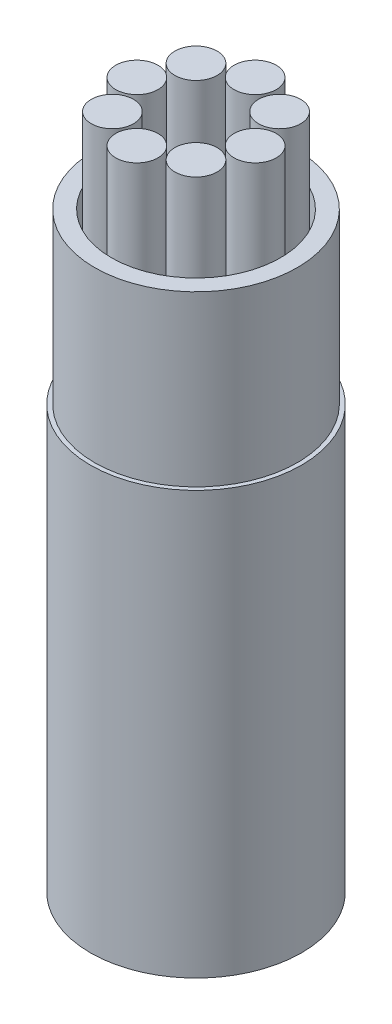
ISO-10303-21;
HEADER;
FILE_DESCRIPTION(('STEP AP214'),'2;1');
FILE_NAME('part.step','',(''),(''),'','','');
FILE_SCHEMA(('AUTOMOTIVE_DESIGN { 1 0 10303 214 1 1 1 1 }'));
ENDSEC;
DATA;
#1=APPLICATION_CONTEXT('core data for automotive mechanical design processes');
#2=APPLICATION_PROTOCOL_DEFINITION('international standard','automotive_design',2000,#1);
#3=PRODUCT_CONTEXT('',#1,'mechanical');
#4=PRODUCT('Part','Part','',(#3));
#5=PRODUCT_RELATED_PRODUCT_CATEGORY('part','',(#4));
#6=PRODUCT_DEFINITION_FORMATION('','',#4);
#7=PRODUCT_DEFINITION_CONTEXT('part definition',#1,'design');
#8=PRODUCT_DEFINITION('design','',#6,#7);
#9=PRODUCT_DEFINITION_SHAPE('','',#8);
#10=(LENGTH_UNIT() NAMED_UNIT(*) SI_UNIT(.MILLI.,.METRE.));
#11=(NAMED_UNIT(*) PLANE_ANGLE_UNIT() SI_UNIT($,.RADIAN.));
#12=(NAMED_UNIT(*) SI_UNIT($,.STERADIAN.) SOLID_ANGLE_UNIT());
#13=UNCERTAINTY_MEASURE_WITH_UNIT(LENGTH_MEASURE(1.E-05),#10,'distance_accuracy_value','');
#14=(GEOMETRIC_REPRESENTATION_CONTEXT(3) GLOBAL_UNCERTAINTY_ASSIGNED_CONTEXT((#13)) GLOBAL_UNIT_ASSIGNED_CONTEXT((#10,
#11,#12)) REPRESENTATION_CONTEXT('',''));
#15=CARTESIAN_POINT('',(0.,0.,0.));
#16=DIRECTION('',(0.,0.,1.));
#17=DIRECTION('',(1.,0.,0.));
#18=AXIS2_PLACEMENT_3D('',#15,#16,#17);
#19=CARTESIAN_POINT('',(0.,10.,0.));
#20=DIRECTION('',(0.,-1.,0.));
#21=DIRECTION('',(0.,0.,-1.));
#22=AXIS2_PLACEMENT_3D('',#19,#20,#21);
#23=CYLINDRICAL_SURFACE('',#22,2.5);
#24=CARTESIAN_POINT('',(0.,10.,0.));
#25=DIRECTION('',(0.,1.,0.));
#26=DIRECTION('',(0.,0.,1.));
#27=AXIS2_PLACEMENT_3D('',#24,#25,#26);
#28=CIRCLE('',#27,2.5);
#29=CARTESIAN_POINT('',(0.,10.,2.5));
#30=VERTEX_POINT('',#29);
#31=EDGE_CURVE('E39',#30,#30,#28,.T.);
#32=ORIENTED_EDGE('',*,*,#31,.F.);
#33=EDGE_LOOP('',(#32));
#34=FACE_BOUND('',#33,.T.);
#35=CARTESIAN_POINT('',(0.,0.,0.));
#36=DIRECTION('',(0.,1.,0.));
#37=DIRECTION('',(0.,0.,1.));
#38=AXIS2_PLACEMENT_3D('',#35,#36,#37);
#39=CIRCLE('',#38,2.5);
#40=CARTESIAN_POINT('',(0.,0.,2.5));
#41=VERTEX_POINT('',#40);
#42=EDGE_CURVE('E43',#41,#41,#39,.T.);
#43=ORIENTED_EDGE('',*,*,#42,.T.);
#44=EDGE_LOOP('',(#43));
#45=FACE_BOUND('',#44,.T.);
#46=ADVANCED_FACE('F33',(#34,#45),#23,.T.);
#47=CARTESIAN_POINT('',(0.,10.,0.));
#48=DIRECTION('',(0.,1.,0.));
#49=DIRECTION('',(0.,0.,1.));
#50=AXIS2_PLACEMENT_3D('',#47,#48,#49);
#51=PLANE('',#50);
#52=CARTESIAN_POINT('',(0.,10.,0.));
#53=DIRECTION('',(0.,1.,0.));
#54=DIRECTION('',(0.,0.,1.));
#55=AXIS2_PLACEMENT_3D('',#52,#53,#54);
#56=CIRCLE('',#55,2.4);
#57=CARTESIAN_POINT('',(0.,10.,2.4));
#58=VERTEX_POINT('',#57);
#59=EDGE_CURVE('E98',#58,#58,#56,.T.);
#60=ORIENTED_EDGE('',*,*,#59,.F.);
#61=EDGE_LOOP('',(#60));
#62=FACE_BOUND('',#61,.T.);
#63=ORIENTED_EDGE('',*,*,#31,.T.);
#64=EDGE_LOOP('',(#63));
#65=FACE_BOUND('',#64,.T.);
#66=ADVANCED_FACE('F121',(#62,#65),#51,.T.);
#67=CARTESIAN_POINT('',(0.,0.,0.));
#68=DIRECTION('',(0.,1.,0.));
#69=DIRECTION('',(0.,0.,1.));
#70=AXIS2_PLACEMENT_3D('',#67,#68,#69);
#71=PLANE('',#70);
#72=ORIENTED_EDGE('',*,*,#42,.F.);
#73=EDGE_LOOP('',(#72));
#74=FACE_BOUND('',#73,.T.);
#75=ADVANCED_FACE('F112',(#74),#71,.F.);
#76=CARTESIAN_POINT('',(0.,14.,0.));
#77=DIRECTION('',(0.,1.,0.));
#78=DIRECTION('',(0.,0.,1.));
#79=AXIS2_PLACEMENT_3D('',#76,#77,#78);
#80=PLANE('',#79);
#81=CARTESIAN_POINT('',(0.,14.,0.));
#82=DIRECTION('',(0.,1.,0.));
#83=DIRECTION('',(0.,0.,1.));
#84=AXIS2_PLACEMENT_3D('',#81,#82,#83);
#85=CIRCLE('',#84,2.4);
#86=CARTESIAN_POINT('',(0.,14.,2.4));
#87=VERTEX_POINT('',#86);
#88=EDGE_CURVE('E97',#87,#87,#85,.T.);
#89=ORIENTED_EDGE('',*,*,#88,.T.);
#90=EDGE_LOOP('',(#89));
#91=FACE_BOUND('',#90,.T.);
#92=CARTESIAN_POINT('',(0.,14.,0.));
#93=DIRECTION('',(0.,1.,0.));
#94=DIRECTION('',(0.,0.,1.));
#95=AXIS2_PLACEMENT_3D('',#92,#93,#94);
#96=CIRCLE('',#95,2.);
#97=CARTESIAN_POINT('',(0.,14.,2.));
#98=VERTEX_POINT('',#97);
#99=EDGE_CURVE('E101',#98,#98,#96,.T.);
#100=ORIENTED_EDGE('',*,*,#99,.F.);
#101=EDGE_LOOP('',(#100));
#102=FACE_BOUND('',#101,.T.);
#103=ADVANCED_FACE('F109',(#91,#102),#80,.T.);
#104=CARTESIAN_POINT('',(0.,14.,0.));
#105=DIRECTION('',(0.,-1.,0.));
#106=DIRECTION('',(0.,0.,-1.));
#107=AXIS2_PLACEMENT_3D('',#104,#105,#106);
#108=CYLINDRICAL_SURFACE('',#107,2.4);
#109=ORIENTED_EDGE('',*,*,#88,.F.);
#110=EDGE_LOOP('',(#109));
#111=FACE_BOUND('',#110,.T.);
#112=ORIENTED_EDGE('',*,*,#59,.T.);
#113=EDGE_LOOP('',(#112));
#114=FACE_BOUND('',#113,.T.);
#115=ADVANCED_FACE('F111',(#111,#114),#108,.T.);
#116=CARTESIAN_POINT('',(0.,14.,0.));
#117=DIRECTION('',(0.,-1.,0.));
#118=DIRECTION('',(0.,0.,-1.));
#119=AXIS2_PLACEMENT_3D('',#116,#117,#118);
#120=CYLINDRICAL_SURFACE('',#119,2.);
#121=ORIENTED_EDGE('',*,*,#99,.T.);
#122=EDGE_LOOP('',(#121));
#123=FACE_BOUND('',#122,.T.);
#124=CARTESIAN_POINT('',(0.,10.,0.));
#125=DIRECTION('',(0.,1.,0.));
#126=DIRECTION('',(0.,0.,1.));
#127=AXIS2_PLACEMENT_3D('',#124,#125,#126);
#128=CIRCLE('',#127,2.);
#129=CARTESIAN_POINT('',(0.,10.,2.));
#130=VERTEX_POINT('',#129);
#131=EDGE_CURVE('E10',#130,#130,#128,.F.);
#132=ORIENTED_EDGE('',*,*,#131,.T.);
#133=EDGE_LOOP('',(#132));
#134=FACE_BOUND('',#133,.T.);
#135=ADVANCED_FACE('F107',(#123,#134),#120,.F.);
#136=CARTESIAN_POINT('',(0.,16.,-1.4));
#137=DIRECTION('',(0.,1.,0.));
#138=DIRECTION('',(0.,0.,1.));
#139=AXIS2_PLACEMENT_3D('',#136,#137,#138);
#140=PLANE('',#139);
#141=CARTESIAN_POINT('',(-0.989949493661167,16.,-0.989949493661167));
#142=DIRECTION('',(0.,1.,0.));
#143=DIRECTION('',(0.,0.,1.));
#144=AXIS2_PLACEMENT_3D('',#141,#142,#143);
#145=CIRCLE('',#144,0.5);
#146=CARTESIAN_POINT('',(-0.989949493661167,16.,-0.489949493661166));
#147=VERTEX_POINT('',#146);
#148=EDGE_CURVE('E91',#147,#147,#145,.T.);
#149=ORIENTED_EDGE('',*,*,#148,.T.);
#150=EDGE_LOOP('',(#149));
#151=FACE_BOUND('',#150,.T.);
#152=ADVANCED_FACE('F171',(#151),#140,.T.);
#153=CARTESIAN_POINT('',(0.,16.,-1.4));
#154=DIRECTION('',(0.,1.,0.));
#155=DIRECTION('',(0.,0.,1.));
#156=AXIS2_PLACEMENT_3D('',#153,#154,#155);
#157=PLANE('',#156);
#158=CARTESIAN_POINT('',(-1.4,16.,0.));
#159=DIRECTION('',(0.,1.,0.));
#160=DIRECTION('',(0.,0.,1.));
#161=AXIS2_PLACEMENT_3D('',#158,#159,#160);
#162=CIRCLE('',#161,0.5);
#163=CARTESIAN_POINT('',(-1.4,16.,0.5));
#164=VERTEX_POINT('',#163);
#165=EDGE_CURVE('E85',#164,#164,#162,.T.);
#166=ORIENTED_EDGE('',*,*,#165,.T.);
#167=EDGE_LOOP('',(#166));
#168=FACE_BOUND('',#167,.T.);
#169=ADVANCED_FACE('F173',(#168),#157,.T.);
#170=CARTESIAN_POINT('',(0.,16.,-1.4));
#171=DIRECTION('',(0.,1.,0.));
#172=DIRECTION('',(0.,0.,1.));
#173=AXIS2_PLACEMENT_3D('',#170,#171,#172);
#174=PLANE('',#173);
#175=CARTESIAN_POINT('',(-0.989949493661166,16.,0.989949493661167));
#176=DIRECTION('',(0.,1.,0.));
#177=DIRECTION('',(0.,0.,1.));
#178=AXIS2_PLACEMENT_3D('',#175,#176,#177);
#179=CIRCLE('',#178,0.5);
#180=CARTESIAN_POINT('',(-0.989949493661166,16.,1.48994949366117));
#181=VERTEX_POINT('',#180);
#182=EDGE_CURVE('E79',#181,#181,#179,.T.);
#183=ORIENTED_EDGE('',*,*,#182,.T.);
#184=EDGE_LOOP('',(#183));
#185=FACE_BOUND('',#184,.T.);
#186=ADVANCED_FACE('F179',(#185),#174,.T.);
#187=CARTESIAN_POINT('',(0.,16.,-1.4));
#188=DIRECTION('',(0.,1.,0.));
#189=DIRECTION('',(0.,0.,1.));
#190=AXIS2_PLACEMENT_3D('',#187,#188,#189);
#191=PLANE('',#190);
#192=CARTESIAN_POINT('',(0.,16.,1.4));
#193=DIRECTION('',(0.,1.,0.));
#194=DIRECTION('',(0.,0.,1.));
#195=AXIS2_PLACEMENT_3D('',#192,#193,#194);
#196=CIRCLE('',#195,0.5);
#197=CARTESIAN_POINT('',(0.,16.,1.9));
#198=VERTEX_POINT('',#197);
#199=EDGE_CURVE('E73',#198,#198,#196,.T.);
#200=ORIENTED_EDGE('',*,*,#199,.T.);
#201=EDGE_LOOP('',(#200));
#202=FACE_BOUND('',#201,.T.);
#203=ADVANCED_FACE('F193',(#202),#191,.T.);
#204=CARTESIAN_POINT('',(0.,16.,-1.4));
#205=DIRECTION('',(0.,1.,0.));
#206=DIRECTION('',(0.,0.,1.));
#207=AXIS2_PLACEMENT_3D('',#204,#205,#206);
#208=PLANE('',#207);
#209=CARTESIAN_POINT('',(0.989949493661167,16.,0.989949493661166));
#210=DIRECTION('',(0.,1.,0.));
#211=DIRECTION('',(0.,0.,1.));
#212=AXIS2_PLACEMENT_3D('',#209,#210,#211);
#213=CIRCLE('',#212,0.5);
#214=CARTESIAN_POINT('',(0.989949493661167,16.,1.48994949366117));
#215=VERTEX_POINT('',#214);
#216=EDGE_CURVE('E67',#215,#215,#213,.T.);
#217=ORIENTED_EDGE('',*,*,#216,.T.);
#218=EDGE_LOOP('',(#217));
#219=FACE_BOUND('',#218,.T.);
#220=ADVANCED_FACE('F201',(#219),#208,.T.);
#221=CARTESIAN_POINT('',(0.,16.,-1.4));
#222=DIRECTION('',(0.,1.,0.));
#223=DIRECTION('',(0.,0.,1.));
#224=AXIS2_PLACEMENT_3D('',#221,#222,#223);
#225=PLANE('',#224);
#226=CARTESIAN_POINT('',(1.4,16.,0.));
#227=DIRECTION('',(0.,1.,0.));
#228=DIRECTION('',(0.,0.,1.));
#229=AXIS2_PLACEMENT_3D('',#226,#227,#228);
#230=CIRCLE('',#229,0.5);
#231=CARTESIAN_POINT('',(1.4,16.,0.5));
#232=VERTEX_POINT('',#231);
#233=EDGE_CURVE('E61',#232,#232,#230,.T.);
#234=ORIENTED_EDGE('',*,*,#233,.T.);
#235=EDGE_LOOP('',(#234));
#236=FACE_BOUND('',#235,.T.);
#237=ADVANCED_FACE('F209',(#236),#225,.T.);
#238=CARTESIAN_POINT('',(0.,16.,-1.4));
#239=DIRECTION('',(0.,1.,0.));
#240=DIRECTION('',(0.,0.,1.));
#241=AXIS2_PLACEMENT_3D('',#238,#239,#240);
#242=PLANE('',#241);
#243=CARTESIAN_POINT('',(0.989949493661166,16.,-0.989949493661167));
#244=DIRECTION('',(0.,1.,0.));
#245=DIRECTION('',(0.,0.,1.));
#246=AXIS2_PLACEMENT_3D('',#243,#244,#245);
#247=CIRCLE('',#246,0.5);
#248=CARTESIAN_POINT('',(0.989949493661166,16.,-0.489949493661167));
#249=VERTEX_POINT('',#248);
#250=EDGE_CURVE('E53',#249,#249,#247,.T.);
#251=ORIENTED_EDGE('',*,*,#250,.T.);
#252=EDGE_LOOP('',(#251));
#253=FACE_BOUND('',#252,.T.);
#254=ADVANCED_FACE('F216',(#253),#242,.T.);
#255=CARTESIAN_POINT('',(0.,16.,-1.4));
#256=DIRECTION('',(0.,1.,0.));
#257=DIRECTION('',(0.,0.,1.));
#258=AXIS2_PLACEMENT_3D('',#255,#256,#257);
#259=PLANE('',#258);
#260=CARTESIAN_POINT('',(0.,16.,-1.4));
#261=DIRECTION('',(0.,1.,0.));
#262=DIRECTION('',(0.,0.,1.));
#263=AXIS2_PLACEMENT_3D('',#260,#261,#262);
#264=CIRCLE('',#263,0.5);
#265=CARTESIAN_POINT('',(0.,16.,-0.9));
#266=VERTEX_POINT('',#265);
#267=EDGE_CURVE('E48',#266,#266,#264,.T.);
#268=ORIENTED_EDGE('',*,*,#267,.T.);
#269=EDGE_LOOP('',(#268));
#270=FACE_BOUND('',#269,.T.);
#271=ADVANCED_FACE('F167',(#270),#259,.T.);
#272=CARTESIAN_POINT('',(-0.989949493661167,17.4142135623731,-0.989949493661167));
#273=DIRECTION('',(0.,-1.,0.));
#274=DIRECTION('',(0.,0.,-1.));
#275=AXIS2_PLACEMENT_3D('',#272,#273,#274);
#276=CYLINDRICAL_SURFACE('',#275,0.5);
#277=CARTESIAN_POINT('',(-0.989949493661167,10.,-0.989949493661167));
#278=DIRECTION('',(0.,1.,0.));
#279=DIRECTION('',(0.,0.,1.));
#280=AXIS2_PLACEMENT_3D('',#277,#278,#279);
#281=CIRCLE('',#280,0.5);
#282=CARTESIAN_POINT('',(-0.989949493661167,10.,-0.489949493661166));
#283=VERTEX_POINT('',#282);
#284=EDGE_CURVE('E94',#283,#283,#281,.T.);
#285=ORIENTED_EDGE('',*,*,#284,.T.);
#286=EDGE_LOOP('',(#285));
#287=FACE_BOUND('',#286,.T.);
#288=ORIENTED_EDGE('',*,*,#148,.F.);
#289=EDGE_LOOP('',(#288));
#290=FACE_BOUND('',#289,.T.);
#291=ADVANCED_FACE('F163',(#287,#290),#276,.T.);
#292=CARTESIAN_POINT('',(-1.4,17.4142135623731,0.));
#293=DIRECTION('',(0.,-1.,0.));
#294=DIRECTION('',(0.,0.,-1.));
#295=AXIS2_PLACEMENT_3D('',#292,#293,#294);
#296=CYLINDRICAL_SURFACE('',#295,0.5);
#297=CARTESIAN_POINT('',(-1.4,10.,0.));
#298=DIRECTION('',(0.,1.,0.));
#299=DIRECTION('',(0.,0.,1.));
#300=AXIS2_PLACEMENT_3D('',#297,#298,#299);
#301=CIRCLE('',#300,0.5);
#302=CARTESIAN_POINT('',(-1.4,10.,0.5));
#303=VERTEX_POINT('',#302);
#304=EDGE_CURVE('E88',#303,#303,#301,.T.);
#305=ORIENTED_EDGE('',*,*,#304,.T.);
#306=EDGE_LOOP('',(#305));
#307=FACE_BOUND('',#306,.T.);
#308=ORIENTED_EDGE('',*,*,#165,.F.);
#309=EDGE_LOOP('',(#308));
#310=FACE_BOUND('',#309,.T.);
#311=ADVANCED_FACE('F166',(#307,#310),#296,.T.);
#312=CARTESIAN_POINT('',(-0.989949493661166,17.4142135623731,0.989949493661167));
#313=DIRECTION('',(0.,-1.,0.));
#314=DIRECTION('',(0.,0.,-1.));
#315=AXIS2_PLACEMENT_3D('',#312,#313,#314);
#316=CYLINDRICAL_SURFACE('',#315,0.5);
#317=CARTESIAN_POINT('',(-0.989949493661166,10.,0.989949493661167));
#318=DIRECTION('',(0.,1.,0.));
#319=DIRECTION('',(0.,0.,1.));
#320=AXIS2_PLACEMENT_3D('',#317,#318,#319);
#321=CIRCLE('',#320,0.5);
#322=CARTESIAN_POINT('',(-0.989949493661166,10.,1.48994949366117));
#323=VERTEX_POINT('',#322);
#324=EDGE_CURVE('E82',#323,#323,#321,.T.);
#325=ORIENTED_EDGE('',*,*,#324,.T.);
#326=EDGE_LOOP('',(#325));
#327=FACE_BOUND('',#326,.T.);
#328=ORIENTED_EDGE('',*,*,#182,.F.);
#329=EDGE_LOOP('',(#328));
#330=FACE_BOUND('',#329,.T.);
#331=ADVANCED_FACE('F184',(#327,#330),#316,.T.);
#332=CARTESIAN_POINT('',(0.,17.4142135623731,1.4));
#333=DIRECTION('',(0.,-1.,0.));
#334=DIRECTION('',(0.,0.,-1.));
#335=AXIS2_PLACEMENT_3D('',#332,#333,#334);
#336=CYLINDRICAL_SURFACE('',#335,0.5);
#337=CARTESIAN_POINT('',(0.,10.,1.4));
#338=DIRECTION('',(0.,1.,0.));
#339=DIRECTION('',(0.,0.,1.));
#340=AXIS2_PLACEMENT_3D('',#337,#338,#339);
#341=CIRCLE('',#340,0.5);
#342=CARTESIAN_POINT('',(0.,10.,1.9));
#343=VERTEX_POINT('',#342);
#344=EDGE_CURVE('E76',#343,#343,#341,.T.);
#345=ORIENTED_EDGE('',*,*,#344,.T.);
#346=EDGE_LOOP('',(#345));
#347=FACE_BOUND('',#346,.T.);
#348=ORIENTED_EDGE('',*,*,#199,.F.);
#349=EDGE_LOOP('',(#348));
#350=FACE_BOUND('',#349,.T.);
#351=ADVANCED_FACE('F189',(#347,#350),#336,.T.);
#352=CARTESIAN_POINT('',(0.989949493661167,17.4142135623731,0.989949493661166));
#353=DIRECTION('',(0.,-1.,0.));
#354=DIRECTION('',(0.,0.,-1.));
#355=AXIS2_PLACEMENT_3D('',#352,#353,#354);
#356=CYLINDRICAL_SURFACE('',#355,0.5);
#357=CARTESIAN_POINT('',(0.989949493661167,10.,0.989949493661166));
#358=DIRECTION('',(0.,1.,0.));
#359=DIRECTION('',(0.,0.,1.));
#360=AXIS2_PLACEMENT_3D('',#357,#358,#359);
#361=CIRCLE('',#360,0.5);
#362=CARTESIAN_POINT('',(0.989949493661167,10.,1.48994949366117));
#363=VERTEX_POINT('',#362);
#364=EDGE_CURVE('E70',#363,#363,#361,.T.);
#365=ORIENTED_EDGE('',*,*,#364,.T.);
#366=EDGE_LOOP('',(#365));
#367=FACE_BOUND('',#366,.T.);
#368=ORIENTED_EDGE('',*,*,#216,.F.);
#369=EDGE_LOOP('',(#368));
#370=FACE_BOUND('',#369,.T.);
#371=ADVANCED_FACE('F197',(#367,#370),#356,.T.);
#372=CARTESIAN_POINT('',(1.4,17.4142135623731,0.));
#373=DIRECTION('',(0.,-1.,0.));
#374=DIRECTION('',(0.,0.,-1.));
#375=AXIS2_PLACEMENT_3D('',#372,#373,#374);
#376=CYLINDRICAL_SURFACE('',#375,0.5);
#377=CARTESIAN_POINT('',(1.4,10.,0.));
#378=DIRECTION('',(0.,1.,0.));
#379=DIRECTION('',(0.,0.,1.));
#380=AXIS2_PLACEMENT_3D('',#377,#378,#379);
#381=CIRCLE('',#380,0.5);
#382=CARTESIAN_POINT('',(1.4,10.,0.5));
#383=VERTEX_POINT('',#382);
#384=EDGE_CURVE('E64',#383,#383,#381,.T.);
#385=ORIENTED_EDGE('',*,*,#384,.T.);
#386=EDGE_LOOP('',(#385));
#387=FACE_BOUND('',#386,.T.);
#388=ORIENTED_EDGE('',*,*,#233,.F.);
#389=EDGE_LOOP('',(#388));
#390=FACE_BOUND('',#389,.T.);
#391=ADVANCED_FACE('F205',(#387,#390),#376,.T.);
#392=CARTESIAN_POINT('',(0.989949493661166,17.4142135623731,-0.989949493661167));
#393=DIRECTION('',(0.,-1.,0.));
#394=DIRECTION('',(0.,0.,-1.));
#395=AXIS2_PLACEMENT_3D('',#392,#393,#394);
#396=CYLINDRICAL_SURFACE('',#395,0.5);
#397=CARTESIAN_POINT('',(0.989949493661166,10.,-0.989949493661167));
#398=DIRECTION('',(0.,1.,0.));
#399=DIRECTION('',(0.,0.,1.));
#400=AXIS2_PLACEMENT_3D('',#397,#398,#399);
#401=CIRCLE('',#400,0.5);
#402=CARTESIAN_POINT('',(0.989949493661166,10.,-0.489949493661167));
#403=VERTEX_POINT('',#402);
#404=EDGE_CURVE('E58',#403,#403,#401,.T.);
#405=ORIENTED_EDGE('',*,*,#404,.T.);
#406=EDGE_LOOP('',(#405));
#407=FACE_BOUND('',#406,.T.);
#408=ORIENTED_EDGE('',*,*,#250,.F.);
#409=EDGE_LOOP('',(#408));
#410=FACE_BOUND('',#409,.T.);
#411=ADVANCED_FACE('F144',(#407,#410),#396,.T.);
#412=CARTESIAN_POINT('',(0.,16.,-1.4));
#413=DIRECTION('',(0.,-1.,0.));
#414=DIRECTION('',(0.,0.,-1.));
#415=AXIS2_PLACEMENT_3D('',#412,#413,#414);
#416=CYLINDRICAL_SURFACE('',#415,0.5);
#417=ORIENTED_EDGE('',*,*,#267,.F.);
#418=EDGE_LOOP('',(#417));
#419=FACE_BOUND('',#418,.T.);
#420=CARTESIAN_POINT('',(0.,10.,-1.4));
#421=DIRECTION('',(0.,1.,0.));
#422=DIRECTION('',(0.,0.,1.));
#423=AXIS2_PLACEMENT_3D('',#420,#421,#422);
#424=CIRCLE('',#423,0.5);
#425=CARTESIAN_POINT('',(0.,10.,-0.9));
#426=VERTEX_POINT('',#425);
#427=EDGE_CURVE('E50',#426,#426,#424,.T.);
#428=ORIENTED_EDGE('',*,*,#427,.T.);
#429=EDGE_LOOP('',(#428));
#430=FACE_BOUND('',#429,.T.);
#431=ADVANCED_FACE('F139',(#419,#430),#416,.T.);
#432=ORIENTED_EDGE('',*,*,#427,.F.);
#433=EDGE_LOOP('',(#432));
#434=FACE_BOUND('',#433,.T.);
#435=ORIENTED_EDGE('',*,*,#404,.F.);
#436=EDGE_LOOP('',(#435));
#437=FACE_BOUND('',#436,.T.);
#438=ORIENTED_EDGE('',*,*,#384,.F.);
#439=EDGE_LOOP('',(#438));
#440=FACE_BOUND('',#439,.T.);
#441=ORIENTED_EDGE('',*,*,#364,.F.);
#442=EDGE_LOOP('',(#441));
#443=FACE_BOUND('',#442,.T.);
#444=ORIENTED_EDGE('',*,*,#344,.F.);
#445=EDGE_LOOP('',(#444));
#446=FACE_BOUND('',#445,.T.);
#447=ORIENTED_EDGE('',*,*,#324,.F.);
#448=EDGE_LOOP('',(#447));
#449=FACE_BOUND('',#448,.T.);
#450=ORIENTED_EDGE('',*,*,#304,.F.);
#451=EDGE_LOOP('',(#450));
#452=FACE_BOUND('',#451,.T.);
#453=ORIENTED_EDGE('',*,*,#284,.F.);
#454=EDGE_LOOP('',(#453));
#455=FACE_BOUND('',#454,.T.);
#456=ORIENTED_EDGE('',*,*,#131,.F.);
#457=EDGE_LOOP('',(#456));
#458=FACE_BOUND('',#457,.T.);
#459=ADVANCED_FACE('F131',(#434,#437,#440,#443,#446,#449,#452,#455,#458),#51,.T.);
#460=CLOSED_SHELL('',(#46,#66,#75,#103,#115,#135,#152,#169,#186,#203,#220,#237,#254,#271,#291,
#311,#331,#351,#371,#391,#411,#431,#459));
#461=MANIFOLD_SOLID_BREP('B2',#460);
#462=ADVANCED_BREP_SHAPE_REPRESENTATION('',(#18,#461),#14);
#463=SHAPE_DEFINITION_REPRESENTATION(#9,#462);
ENDSEC;
END-ISO-10303-21;
